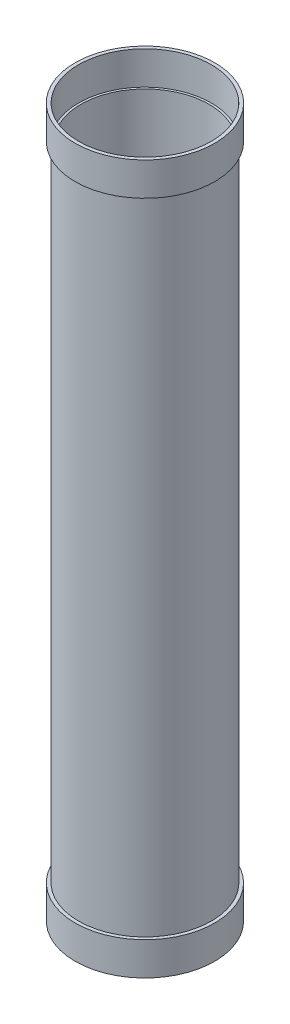
ISO-10303-21;
HEADER;
FILE_DESCRIPTION(('STEP AP214'),'2;1');
FILE_NAME('part.step','',(''),(''),'','','');
FILE_SCHEMA(('AUTOMOTIVE_DESIGN { 1 0 10303 214 1 1 1 1 }'));
ENDSEC;
DATA;
#1=APPLICATION_CONTEXT('core data for automotive mechanical design processes');
#2=APPLICATION_PROTOCOL_DEFINITION('international standard','automotive_design',2000,#1);
#3=PRODUCT_CONTEXT('',#1,'mechanical');
#4=PRODUCT('Part','Part','',(#3));
#5=PRODUCT_RELATED_PRODUCT_CATEGORY('part','',(#4));
#6=PRODUCT_DEFINITION_FORMATION('','',#4);
#7=PRODUCT_DEFINITION_CONTEXT('part definition',#1,'design');
#8=PRODUCT_DEFINITION('design','',#6,#7);
#9=PRODUCT_DEFINITION_SHAPE('','',#8);
#10=(LENGTH_UNIT() NAMED_UNIT(*) SI_UNIT(.MILLI.,.METRE.));
#11=(NAMED_UNIT(*) PLANE_ANGLE_UNIT() SI_UNIT($,.RADIAN.));
#12=(NAMED_UNIT(*) SI_UNIT($,.STERADIAN.) SOLID_ANGLE_UNIT());
#13=UNCERTAINTY_MEASURE_WITH_UNIT(LENGTH_MEASURE(1.E-05),#10,'distance_accuracy_value','');
#14=(GEOMETRIC_REPRESENTATION_CONTEXT(3) GLOBAL_UNCERTAINTY_ASSIGNED_CONTEXT((#13)) GLOBAL_UNIT_ASSIGNED_CONTEXT((#10,
#11,#12)) REPRESENTATION_CONTEXT('',''));
#15=CARTESIAN_POINT('',(0.,0.,0.));
#16=DIRECTION('',(0.,0.,1.));
#17=DIRECTION('',(1.,0.,0.));
#18=AXIS2_PLACEMENT_3D('',#15,#16,#17);
#19=CARTESIAN_POINT('',(0.,290.,0.));
#20=DIRECTION('',(0.,1.,0.));
#21=DIRECTION('',(0.,0.,1.));
#22=AXIS2_PLACEMENT_3D('',#19,#20,#21);
#23=PLANE('',#22);
#24=CARTESIAN_POINT('',(0.,290.,0.));
#25=DIRECTION('',(0.,1.,0.));
#26=DIRECTION('',(0.,0.,1.));
#27=AXIS2_PLACEMENT_3D('',#24,#25,#26);
#28=CIRCLE('',#27,30.);
#29=CARTESIAN_POINT('',(0.,290.,30.));
#30=VERTEX_POINT('',#29);
#31=EDGE_CURVE('E60',#30,#30,#28,.T.);
#32=ORIENTED_EDGE('',*,*,#31,.T.);
#33=EDGE_LOOP('',(#32));
#34=FACE_BOUND('',#33,.T.);
#35=CARTESIAN_POINT('',(0.,290.,0.));
#36=DIRECTION('',(0.,1.,0.));
#37=DIRECTION('',(0.,0.,1.));
#38=AXIS2_PLACEMENT_3D('',#35,#36,#37);
#39=CIRCLE('',#38,31.5302561873739);
#40=CARTESIAN_POINT('',(0.,290.,31.5302561873739));
#41=VERTEX_POINT('',#40);
#42=EDGE_CURVE('E52',#41,#41,#39,.T.);
#43=ORIENTED_EDGE('',*,*,#42,.F.);
#44=EDGE_LOOP('',(#43));
#45=FACE_BOUND('',#44,.T.);
#46=ADVANCED_FACE('F46',(#34,#45),#23,.F.);
#47=CARTESIAN_POINT('',(0.,305.,0.));
#48=DIRECTION('',(0.,1.,0.));
#49=DIRECTION('',(0.,0.,1.));
#50=AXIS2_PLACEMENT_3D('',#47,#48,#49);
#51=PLANE('',#50);
#52=CARTESIAN_POINT('',(0.,305.,0.));
#53=DIRECTION('',(0.,1.,0.));
#54=DIRECTION('',(0.,0.,1.));
#55=AXIS2_PLACEMENT_3D('',#52,#53,#54);
#56=CIRCLE('',#55,30.);
#57=CARTESIAN_POINT('',(0.,305.,30.));
#58=VERTEX_POINT('',#57);
#59=EDGE_CURVE('E56',#58,#58,#56,.T.);
#60=ORIENTED_EDGE('',*,*,#59,.F.);
#61=EDGE_LOOP('',(#60));
#62=FACE_BOUND('',#61,.T.);
#63=CARTESIAN_POINT('',(0.,305.,0.));
#64=DIRECTION('',(0.,1.,0.));
#65=DIRECTION('',(0.,0.,1.));
#66=AXIS2_PLACEMENT_3D('',#63,#64,#65);
#67=CIRCLE('',#66,31.5302561873739);
#68=CARTESIAN_POINT('',(0.,305.,31.5302561873739));
#69=VERTEX_POINT('',#68);
#70=EDGE_CURVE('E12',#69,#69,#67,.T.);
#71=ORIENTED_EDGE('',*,*,#70,.T.);
#72=EDGE_LOOP('',(#71));
#73=FACE_BOUND('',#72,.T.);
#74=ADVANCED_FACE('F75',(#62,#73),#51,.T.);
#75=CARTESIAN_POINT('',(0.,290.,0.));
#76=DIRECTION('',(0.,1.,0.));
#77=DIRECTION('',(0.,0.,1.));
#78=AXIS2_PLACEMENT_3D('',#75,#76,#77);
#79=CYLINDRICAL_SURFACE('',#78,31.5302561873739);
#80=ORIENTED_EDGE('',*,*,#42,.T.);
#81=EDGE_LOOP('',(#80));
#82=FACE_BOUND('',#81,.T.);
#83=ORIENTED_EDGE('',*,*,#70,.F.);
#84=EDGE_LOOP('',(#83));
#85=FACE_BOUND('',#84,.T.);
#86=ADVANCED_FACE('F71',(#82,#85),#79,.T.);
#87=CARTESIAN_POINT('',(0.,290.,0.));
#88=DIRECTION('',(0.,1.,0.));
#89=DIRECTION('',(0.,0.,1.));
#90=AXIS2_PLACEMENT_3D('',#87,#88,#89);
#91=CYLINDRICAL_SURFACE('',#90,30.);
#92=ORIENTED_EDGE('',*,*,#31,.F.);
#93=EDGE_LOOP('',(#92));
#94=FACE_BOUND('',#93,.T.);
#95=ORIENTED_EDGE('',*,*,#59,.T.);
#96=EDGE_LOOP('',(#95));
#97=FACE_BOUND('',#96,.T.);
#98=ADVANCED_FACE('F68',(#94,#97),#91,.F.);
#99=CLOSED_SHELL('',(#46,#74,#86,#98));
#100=MANIFOLD_SOLID_BREP('B2',#99);
#101=CARTESIAN_POINT('',(0.,-15.,0.));
#102=DIRECTION('',(0.,1.,0.));
#103=DIRECTION('',(0.,0.,1.));
#104=AXIS2_PLACEMENT_3D('',#101,#102,#103);
#105=CYLINDRICAL_SURFACE('',#104,31.5);
#106=CARTESIAN_POINT('',(0.,-15.,0.));
#107=DIRECTION('',(0.,1.,0.));
#108=DIRECTION('',(0.,0.,1.));
#109=AXIS2_PLACEMENT_3D('',#106,#107,#108);
#110=CIRCLE('',#109,31.5);
#111=CARTESIAN_POINT('',(0.,-15.,31.5));
#112=VERTEX_POINT('',#111);
#113=EDGE_CURVE('E45',#112,#112,#110,.T.);
#114=ORIENTED_EDGE('',*,*,#113,.T.);
#115=EDGE_LOOP('',(#114));
#116=FACE_BOUND('',#115,.T.);
#117=CARTESIAN_POINT('',(0.,0.,0.));
#118=DIRECTION('',(0.,1.,0.));
#119=DIRECTION('',(0.,0.,1.));
#120=AXIS2_PLACEMENT_3D('',#117,#118,#119);
#121=CIRCLE('',#120,31.5);
#122=CARTESIAN_POINT('',(0.,0.,31.5));
#123=VERTEX_POINT('',#122);
#124=EDGE_CURVE('E120',#123,#123,#121,.T.);
#125=ORIENTED_EDGE('',*,*,#124,.F.);
#126=EDGE_LOOP('',(#125));
#127=FACE_BOUND('',#126,.T.);
#128=ADVANCED_FACE('F117',(#116,#127),#105,.T.);
#129=CARTESIAN_POINT('',(0.,-15.,0.));
#130=DIRECTION('',(0.,1.,0.));
#131=DIRECTION('',(0.,0.,1.));
#132=AXIS2_PLACEMENT_3D('',#129,#130,#131);
#133=PLANE('',#132);
#134=CARTESIAN_POINT('',(0.,-15.,0.));
#135=DIRECTION('',(0.,1.,0.));
#136=DIRECTION('',(0.,0.,1.));
#137=AXIS2_PLACEMENT_3D('',#134,#135,#136);
#138=CIRCLE('',#137,30.);
#139=CARTESIAN_POINT('',(0.,-15.,30.));
#140=VERTEX_POINT('',#139);
#141=EDGE_CURVE('E127',#140,#140,#138,.T.);
#142=ORIENTED_EDGE('',*,*,#141,.T.);
#143=EDGE_LOOP('',(#142));
#144=FACE_BOUND('',#143,.T.);
#145=ORIENTED_EDGE('',*,*,#113,.F.);
#146=EDGE_LOOP('',(#145));
#147=FACE_BOUND('',#146,.T.);
#148=ADVANCED_FACE('F135',(#144,#147),#133,.F.);
#149=CARTESIAN_POINT('',(0.,0.,0.));
#150=DIRECTION('',(0.,1.,0.));
#151=DIRECTION('',(0.,0.,1.));
#152=AXIS2_PLACEMENT_3D('',#149,#150,#151);
#153=PLANE('',#152);
#154=CARTESIAN_POINT('',(0.,0.,0.));
#155=DIRECTION('',(0.,1.,0.));
#156=DIRECTION('',(0.,0.,1.));
#157=AXIS2_PLACEMENT_3D('',#154,#155,#156);
#158=CIRCLE('',#157,30.);
#159=CARTESIAN_POINT('',(0.,0.,30.));
#160=VERTEX_POINT('',#159);
#161=EDGE_CURVE('E129',#160,#160,#158,.T.);
#162=ORIENTED_EDGE('',*,*,#161,.F.);
#163=EDGE_LOOP('',(#162));
#164=FACE_BOUND('',#163,.T.);
#165=ORIENTED_EDGE('',*,*,#124,.T.);
#166=EDGE_LOOP('',(#165));
#167=FACE_BOUND('',#166,.T.);
#168=ADVANCED_FACE('F141',(#164,#167),#153,.T.);
#169=CARTESIAN_POINT('',(0.,-15.,0.));
#170=DIRECTION('',(0.,1.,0.));
#171=DIRECTION('',(0.,0.,1.));
#172=AXIS2_PLACEMENT_3D('',#169,#170,#171);
#173=CYLINDRICAL_SURFACE('',#172,30.);
#174=ORIENTED_EDGE('',*,*,#141,.F.);
#175=EDGE_LOOP('',(#174));
#176=FACE_BOUND('',#175,.T.);
#177=ORIENTED_EDGE('',*,*,#161,.T.);
#178=EDGE_LOOP('',(#177));
#179=FACE_BOUND('',#178,.T.);
#180=ADVANCED_FACE('F138',(#176,#179),#173,.F.);
#181=CLOSED_SHELL('',(#128,#148,#168,#180));
#182=MANIFOLD_SOLID_BREP('B7',#181);
#183=CARTESIAN_POINT('',(0.,290.,0.));
#184=DIRECTION('',(0.,1.,0.));
#185=DIRECTION('',(0.,0.,1.));
#186=AXIS2_PLACEMENT_3D('',#183,#184,#185);
#187=PLANE('',#186);
#188=CARTESIAN_POINT('',(0.,290.,0.));
#189=DIRECTION('',(0.,1.,0.));
#190=DIRECTION('',(0.,0.,1.));
#191=AXIS2_PLACEMENT_3D('',#188,#189,#190);
#192=CIRCLE('',#191,30.);
#193=CARTESIAN_POINT('',(0.,290.,30.));
#194=VERTEX_POINT('',#193);
#195=EDGE_CURVE('E116',#194,#194,#192,.T.);
#196=ORIENTED_EDGE('',*,*,#195,.T.);
#197=EDGE_LOOP('',(#196));
#198=FACE_BOUND('',#197,.T.);
#199=CARTESIAN_POINT('',(0.,290.,0.));
#200=DIRECTION('',(0.,1.,0.));
#201=DIRECTION('',(0.,0.,1.));
#202=AXIS2_PLACEMENT_3D('',#199,#200,#201);
#203=CIRCLE('',#202,29.);
#204=CARTESIAN_POINT('',(0.,290.,29.));
#205=VERTEX_POINT('',#204);
#206=EDGE_CURVE('E192',#205,#205,#203,.T.);
#207=ORIENTED_EDGE('',*,*,#206,.F.);
#208=EDGE_LOOP('',(#207));
#209=FACE_BOUND('',#208,.T.);
#210=ADVANCED_FACE('F181',(#198,#209),#187,.T.);
#211=CARTESIAN_POINT('',(0.,0.,0.));
#212=DIRECTION('',(0.,1.,0.));
#213=DIRECTION('',(0.,0.,1.));
#214=AXIS2_PLACEMENT_3D('',#211,#212,#213);
#215=PLANE('',#214);
#216=CARTESIAN_POINT('',(0.,0.,0.));
#217=DIRECTION('',(0.,1.,0.));
#218=DIRECTION('',(0.,0.,1.));
#219=AXIS2_PLACEMENT_3D('',#216,#217,#218);
#220=CIRCLE('',#219,30.);
#221=CARTESIAN_POINT('',(0.,0.,30.));
#222=VERTEX_POINT('',#221);
#223=EDGE_CURVE('E185',#222,#222,#220,.T.);
#224=ORIENTED_EDGE('',*,*,#223,.F.);
#225=EDGE_LOOP('',(#224));
#226=FACE_BOUND('',#225,.T.);
#227=CARTESIAN_POINT('',(0.,0.,0.));
#228=DIRECTION('',(0.,1.,0.));
#229=DIRECTION('',(0.,0.,1.));
#230=AXIS2_PLACEMENT_3D('',#227,#228,#229);
#231=CIRCLE('',#230,29.);
#232=CARTESIAN_POINT('',(0.,0.,29.));
#233=VERTEX_POINT('',#232);
#234=EDGE_CURVE('E194',#233,#233,#231,.T.);
#235=ORIENTED_EDGE('',*,*,#234,.T.);
#236=EDGE_LOOP('',(#235));
#237=FACE_BOUND('',#236,.T.);
#238=ADVANCED_FACE('F204',(#226,#237),#215,.F.);
#239=CARTESIAN_POINT('',(0.,290.,0.));
#240=DIRECTION('',(0.,-1.,0.));
#241=DIRECTION('',(0.,0.,-1.));
#242=AXIS2_PLACEMENT_3D('',#239,#240,#241);
#243=CYLINDRICAL_SURFACE('',#242,30.);
#244=ORIENTED_EDGE('',*,*,#195,.F.);
#245=EDGE_LOOP('',(#244));
#246=FACE_BOUND('',#245,.T.);
#247=ORIENTED_EDGE('',*,*,#223,.T.);
#248=EDGE_LOOP('',(#247));
#249=FACE_BOUND('',#248,.T.);
#250=ADVANCED_FACE('F183',(#246,#249),#243,.T.);
#251=CARTESIAN_POINT('',(0.,290.,0.));
#252=DIRECTION('',(0.,-1.,0.));
#253=DIRECTION('',(0.,0.,-1.));
#254=AXIS2_PLACEMENT_3D('',#251,#252,#253);
#255=CYLINDRICAL_SURFACE('',#254,29.);
#256=ORIENTED_EDGE('',*,*,#206,.T.);
#257=EDGE_LOOP('',(#256));
#258=FACE_BOUND('',#257,.T.);
#259=ORIENTED_EDGE('',*,*,#234,.F.);
#260=EDGE_LOOP('',(#259));
#261=FACE_BOUND('',#260,.T.);
#262=ADVANCED_FACE('F200',(#258,#261),#255,.F.);
#263=CLOSED_SHELL('',(#210,#238,#250,#262));
#264=MANIFOLD_SOLID_BREP('B40',#263);
#265=ADVANCED_BREP_SHAPE_REPRESENTATION('',(#18,#100,#182,#264),#14);
#266=SHAPE_DEFINITION_REPRESENTATION(#9,#265);
ENDSEC;
END-ISO-10303-21;
